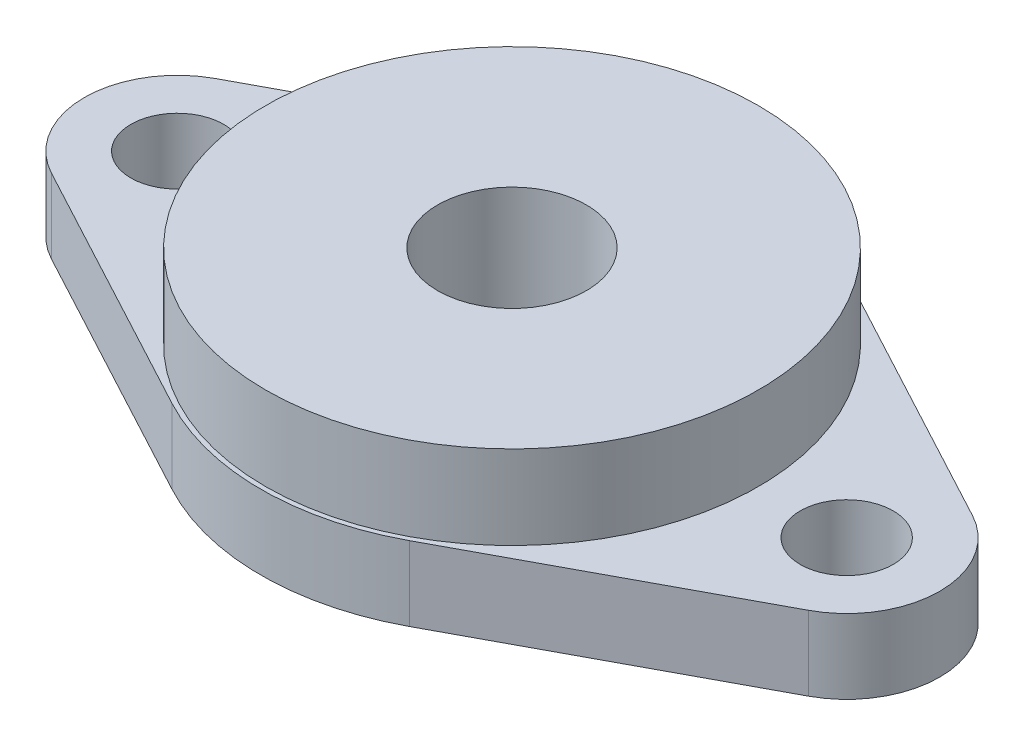
ISO-10303-21;
HEADER;
FILE_DESCRIPTION(('STEP AP214'),'2;1');
FILE_NAME('part.step','',(''),(''),'','','');
FILE_SCHEMA(('AUTOMOTIVE_DESIGN { 1 0 10303 214 1 1 1 1 }'));
ENDSEC;
DATA;
#1=APPLICATION_CONTEXT('core data for automotive mechanical design processes');
#2=APPLICATION_PROTOCOL_DEFINITION('international standard','automotive_design',2000,#1);
#3=PRODUCT_CONTEXT('',#1,'mechanical');
#4=PRODUCT('Part','Part','',(#3));
#5=PRODUCT_RELATED_PRODUCT_CATEGORY('part','',(#4));
#6=PRODUCT_DEFINITION_FORMATION('','',#4);
#7=PRODUCT_DEFINITION_CONTEXT('part definition',#1,'design');
#8=PRODUCT_DEFINITION('design','',#6,#7);
#9=PRODUCT_DEFINITION_SHAPE('','',#8);
#10=(LENGTH_UNIT() NAMED_UNIT(*) SI_UNIT(.MILLI.,.METRE.));
#11=(NAMED_UNIT(*) PLANE_ANGLE_UNIT() SI_UNIT($,.RADIAN.));
#12=(NAMED_UNIT(*) SI_UNIT($,.STERADIAN.) SOLID_ANGLE_UNIT());
#13=UNCERTAINTY_MEASURE_WITH_UNIT(LENGTH_MEASURE(1.E-05),#10,'distance_accuracy_value','');
#14=(GEOMETRIC_REPRESENTATION_CONTEXT(3) GLOBAL_UNCERTAINTY_ASSIGNED_CONTEXT((#13)) GLOBAL_UNIT_ASSIGNED_CONTEXT((#10,
#11,#12)) REPRESENTATION_CONTEXT('',''));
#15=CARTESIAN_POINT('',(0.,0.,0.));
#16=DIRECTION('',(0.,0.,1.));
#17=DIRECTION('',(1.,0.,0.));
#18=AXIS2_PLACEMENT_3D('',#15,#16,#17);
#19=CARTESIAN_POINT('',(0.,4.,0.));
#20=DIRECTION('',(0.,1.,0.));
#21=DIRECTION('',(0.,0.,1.));
#22=AXIS2_PLACEMENT_3D('',#19,#20,#21);
#23=PLANE('',#22);
#24=CARTESIAN_POINT('',(-18.,4.,0.));
#25=DIRECTION('',(0.,1.,0.));
#26=DIRECTION('',(0.,0.,1.));
#27=AXIS2_PLACEMENT_3D('',#24,#25,#26);
#28=CIRCLE('',#27,2.5);
#29=CARTESIAN_POINT('',(-18.,4.,2.5));
#30=VERTEX_POINT('',#29);
#31=EDGE_CURVE('E137',#30,#30,#28,.F.);
#32=ORIENTED_EDGE('',*,*,#31,.T.);
#33=EDGE_LOOP('',(#32));
#34=FACE_BOUND('',#33,.T.);
#35=CARTESIAN_POINT('',(18.,4.,0.));
#36=DIRECTION('',(0.,1.,0.));
#37=DIRECTION('',(0.,0.,1.));
#38=AXIS2_PLACEMENT_3D('',#35,#36,#37);
#39=CIRCLE('',#38,2.5);
#40=CARTESIAN_POINT('',(18.,4.,2.5));
#41=VERTEX_POINT('',#40);
#42=EDGE_CURVE('E131',#41,#41,#39,.T.);
#43=ORIENTED_EDGE('',*,*,#42,.F.);
#44=EDGE_LOOP('',(#43));
#45=FACE_BOUND('',#44,.T.);
#46=CARTESIAN_POINT('',(-18.,4.,0.));
#47=DIRECTION('',(0.,1.,0.));
#48=DIRECTION('',(0.,0.,1.));
#49=AXIS2_PLACEMENT_3D('',#46,#47,#48);
#50=CIRCLE('',#49,4.99999999999999);
#51=CARTESIAN_POINT('',(-20.3611111111111,4.,4.407397681284));
#52=VERTEX_POINT('',#51);
#53=CARTESIAN_POINT('',(-20.3611111111111,4.,-4.407397681284));
#54=VERTEX_POINT('',#53);
#55=EDGE_CURVE('E169',#52,#54,#50,.F.);
#56=ORIENTED_EDGE('',*,*,#55,.F.);
#57=DIRECTION('',(0.881479536256802,0.,0.472222222222222));
#58=VECTOR('',#57,1.);
#59=CARTESIAN_POINT('',(-6.37499999999999,4.,11.8999737394668));
#60=LINE('',#59,#58);
#61=CARTESIAN_POINT('',(-6.37499999999999,4.,11.8999737394668));
#62=VERTEX_POINT('',#61);
#63=EDGE_CURVE('E195',#52,#62,#60,.T.);
#64=ORIENTED_EDGE('',*,*,#63,.T.);
#65=CARTESIAN_POINT('',(0.,4.,0.));
#66=DIRECTION('',(0.,1.,0.));
#67=DIRECTION('',(0.,0.,1.));
#68=AXIS2_PLACEMENT_3D('',#65,#66,#67);
#69=CIRCLE('',#68,13.5);
#70=CARTESIAN_POINT('',(6.37499999999999,4.,11.8999737394668));
#71=VERTEX_POINT('',#70);
#72=EDGE_CURVE('E182',#71,#62,#69,.F.);
#73=ORIENTED_EDGE('',*,*,#72,.F.);
#74=DIRECTION('',(-0.881479536256802,0.,0.472222222222222));
#75=VECTOR('',#74,1.);
#76=CARTESIAN_POINT('',(6.37499999999999,4.,11.8999737394668));
#77=LINE('',#76,#75);
#78=CARTESIAN_POINT('',(20.3611111111111,4.,4.40739768128401));
#79=VERTEX_POINT('',#78);
#80=EDGE_CURVE('E194',#79,#71,#77,.T.);
#81=ORIENTED_EDGE('',*,*,#80,.F.);
#82=CARTESIAN_POINT('',(18.,4.,0.));
#83=DIRECTION('',(0.,1.,0.));
#84=DIRECTION('',(0.,0.,1.));
#85=AXIS2_PLACEMENT_3D('',#82,#83,#84);
#86=CIRCLE('',#85,5.);
#87=CARTESIAN_POINT('',(20.3611111111111,4.,-4.40739768128401));
#88=VERTEX_POINT('',#87);
#89=EDGE_CURVE('E114',#79,#88,#86,.T.);
#90=ORIENTED_EDGE('',*,*,#89,.T.);
#91=DIRECTION('',(-0.881479536256802,0.,-0.472222222222222));
#92=VECTOR('',#91,1.);
#93=CARTESIAN_POINT('',(6.37499999999999,4.,-11.8999737394668));
#94=LINE('',#93,#92);
#95=CARTESIAN_POINT('',(6.37499999999999,4.,-11.8999737394668));
#96=VERTEX_POINT('',#95);
#97=EDGE_CURVE('E105',#88,#96,#94,.T.);
#98=ORIENTED_EDGE('',*,*,#97,.T.);
#99=CARTESIAN_POINT('',(0.,4.,0.));
#100=DIRECTION('',(0.,1.,0.));
#101=DIRECTION('',(0.,0.,1.));
#102=AXIS2_PLACEMENT_3D('',#99,#100,#101);
#103=CIRCLE('',#102,13.5);
#104=CARTESIAN_POINT('',(-6.37499999999999,4.,-11.8999737394668));
#105=VERTEX_POINT('',#104);
#106=EDGE_CURVE('E111',#96,#105,#103,.T.);
#107=ORIENTED_EDGE('',*,*,#106,.T.);
#108=DIRECTION('',(0.881479536256802,0.,-0.472222222222222));
#109=VECTOR('',#108,1.);
#110=CARTESIAN_POINT('',(-6.37499999999999,4.,-11.8999737394668));
#111=LINE('',#110,#109);
#112=EDGE_CURVE('E129',#54,#105,#111,.T.);
#113=ORIENTED_EDGE('',*,*,#112,.F.);
#114=EDGE_LOOP('',(#56,#64,#73,#81,#90,#98,#107,#113));
#115=FACE_BOUND('',#114,.T.);
#116=CARTESIAN_POINT('',(0.,4.,0.));
#117=DIRECTION('',(0.,1.,0.));
#118=DIRECTION('',(0.,0.,1.));
#119=AXIS2_PLACEMENT_3D('',#116,#117,#118);
#120=CIRCLE('',#119,13.25);
#121=CARTESIAN_POINT('',(0.,4.,13.25));
#122=VERTEX_POINT('',#121);
#123=EDGE_CURVE('E201',#122,#122,#120,.T.);
#124=ORIENTED_EDGE('',*,*,#123,.F.);
#125=EDGE_LOOP('',(#124));
#126=FACE_BOUND('',#125,.T.);
#127=ADVANCED_FACE('F38',(#34,#45,#115,#126),#23,.T.);
#128=CARTESIAN_POINT('',(-18.,4.,0.));
#129=DIRECTION('',(0.,-1.,0.));
#130=DIRECTION('',(0.,0.,-1.));
#131=AXIS2_PLACEMENT_3D('',#128,#129,#130);
#132=CYLINDRICAL_SURFACE('',#131,4.99999999999999);
#133=CARTESIAN_POINT('',(-18.,0.,0.));
#134=DIRECTION('',(0.,1.,0.));
#135=DIRECTION('',(0.,0.,1.));
#136=AXIS2_PLACEMENT_3D('',#133,#134,#135);
#137=CIRCLE('',#136,4.99999999999999);
#138=CARTESIAN_POINT('',(-20.3611111111111,0.,4.407397681284));
#139=VERTEX_POINT('',#138);
#140=CARTESIAN_POINT('',(-20.3611111111111,0.,-4.407397681284));
#141=VERTEX_POINT('',#140);
#142=EDGE_CURVE('E140',#139,#141,#137,.F.);
#143=ORIENTED_EDGE('',*,*,#142,.F.);
#144=DIRECTION('',(0.,-1.,0.));
#145=VECTOR('',#144,1.);
#146=CARTESIAN_POINT('',(-20.3611111111111,4.,4.407397681284));
#147=LINE('',#146,#145);
#148=EDGE_CURVE('E11',#52,#139,#147,.T.);
#149=ORIENTED_EDGE('',*,*,#148,.F.);
#150=ORIENTED_EDGE('',*,*,#55,.T.);
#151=DIRECTION('',(0.,-1.,0.));
#152=VECTOR('',#151,1.);
#153=CARTESIAN_POINT('',(-20.3611111111111,4.,-4.407397681284));
#154=LINE('',#153,#152);
#155=EDGE_CURVE('E55',#54,#141,#154,.T.);
#156=ORIENTED_EDGE('',*,*,#155,.T.);
#157=EDGE_LOOP('',(#143,#149,#150,#156));
#158=FACE_BOUND('',#157,.T.);
#159=ADVANCED_FACE('F40',(#158),#132,.T.);
#160=CARTESIAN_POINT('',(-6.37499999999999,4.,11.8999737394668));
#161=DIRECTION('',(0.472222222222222,0.,-0.881479536256802));
#162=DIRECTION('',(-0.881479536256802,0.,-0.472222222222222));
#163=AXIS2_PLACEMENT_3D('',#160,#161,#162);
#164=PLANE('',#163);
#165=DIRECTION('',(0.881479536256802,0.,0.472222222222222));
#166=VECTOR('',#165,1.);
#167=CARTESIAN_POINT('',(-6.37499999999999,0.,11.8999737394668));
#168=LINE('',#167,#166);
#169=CARTESIAN_POINT('',(-6.37499999999999,0.,11.8999737394668));
#170=VERTEX_POINT('',#169);
#171=EDGE_CURVE('E142',#139,#170,#168,.T.);
#172=ORIENTED_EDGE('',*,*,#171,.T.);
#173=DIRECTION('',(0.,-1.,0.));
#174=VECTOR('',#173,1.);
#175=CARTESIAN_POINT('',(-6.37499999999999,4.,11.8999737394668));
#176=LINE('',#175,#174);
#177=EDGE_CURVE('E47',#62,#170,#176,.T.);
#178=ORIENTED_EDGE('',*,*,#177,.F.);
#179=ORIENTED_EDGE('',*,*,#63,.F.);
#180=ORIENTED_EDGE('',*,*,#148,.T.);
#181=EDGE_LOOP('',(#172,#178,#179,#180));
#182=FACE_BOUND('',#181,.T.);
#183=ADVANCED_FACE('F185',(#182),#164,.F.);
#184=CARTESIAN_POINT('',(0.,4.,0.));
#185=DIRECTION('',(0.,-1.,0.));
#186=DIRECTION('',(0.,0.,-1.));
#187=AXIS2_PLACEMENT_3D('',#184,#185,#186);
#188=CYLINDRICAL_SURFACE('',#187,13.5);
#189=CARTESIAN_POINT('',(0.,0.,0.));
#190=DIRECTION('',(0.,1.,0.));
#191=DIRECTION('',(0.,0.,1.));
#192=AXIS2_PLACEMENT_3D('',#189,#190,#191);
#193=CIRCLE('',#192,13.5);
#194=CARTESIAN_POINT('',(6.37499999999999,0.,11.8999737394668));
#195=VERTEX_POINT('',#194);
#196=EDGE_CURVE('E146',#195,#170,#193,.F.);
#197=ORIENTED_EDGE('',*,*,#196,.F.);
#198=DIRECTION('',(0.,-1.,0.));
#199=VECTOR('',#198,1.);
#200=CARTESIAN_POINT('',(6.37499999999999,4.,11.8999737394668));
#201=LINE('',#200,#199);
#202=EDGE_CURVE('E175',#71,#195,#201,.T.);
#203=ORIENTED_EDGE('',*,*,#202,.F.);
#204=ORIENTED_EDGE('',*,*,#72,.T.);
#205=ORIENTED_EDGE('',*,*,#177,.T.);
#206=EDGE_LOOP('',(#197,#203,#204,#205));
#207=FACE_BOUND('',#206,.T.);
#208=ADVANCED_FACE('F180',(#207),#188,.T.);
#209=CARTESIAN_POINT('',(6.37499999999999,4.,11.8999737394668));
#210=DIRECTION('',(0.472222222222222,0.,0.881479536256802));
#211=DIRECTION('',(0.881479536256802,0.,-0.472222222222222));
#212=AXIS2_PLACEMENT_3D('',#209,#210,#211);
#213=PLANE('',#212);
#214=DIRECTION('',(-0.881479536256802,0.,0.472222222222222));
#215=VECTOR('',#214,1.);
#216=CARTESIAN_POINT('',(6.37499999999999,0.,11.8999737394668));
#217=LINE('',#216,#215);
#218=CARTESIAN_POINT('',(20.3611111111111,0.,4.40739768128401));
#219=VERTEX_POINT('',#218);
#220=EDGE_CURVE('E149',#219,#195,#217,.T.);
#221=ORIENTED_EDGE('',*,*,#220,.F.);
#222=DIRECTION('',(0.,-1.,0.));
#223=VECTOR('',#222,1.);
#224=CARTESIAN_POINT('',(20.3611111111111,4.,4.40739768128401));
#225=LINE('',#224,#223);
#226=EDGE_CURVE('E173',#79,#219,#225,.T.);
#227=ORIENTED_EDGE('',*,*,#226,.F.);
#228=ORIENTED_EDGE('',*,*,#80,.T.);
#229=ORIENTED_EDGE('',*,*,#202,.T.);
#230=EDGE_LOOP('',(#221,#227,#228,#229));
#231=FACE_BOUND('',#230,.T.);
#232=ADVANCED_FACE('F192',(#231),#213,.T.);
#233=CARTESIAN_POINT('',(18.,4.,0.));
#234=DIRECTION('',(0.,-1.,0.));
#235=DIRECTION('',(0.,0.,-1.));
#236=AXIS2_PLACEMENT_3D('',#233,#234,#235);
#237=CYLINDRICAL_SURFACE('',#236,5.);
#238=CARTESIAN_POINT('',(18.,0.,0.));
#239=DIRECTION('',(0.,1.,0.));
#240=DIRECTION('',(0.,0.,1.));
#241=AXIS2_PLACEMENT_3D('',#238,#239,#240);
#242=CIRCLE('',#241,5.);
#243=CARTESIAN_POINT('',(20.3611111111111,0.,-4.40739768128401));
#244=VERTEX_POINT('',#243);
#245=EDGE_CURVE('E152',#219,#244,#242,.T.);
#246=ORIENTED_EDGE('',*,*,#245,.T.);
#247=DIRECTION('',(0.,-1.,0.));
#248=VECTOR('',#247,1.);
#249=CARTESIAN_POINT('',(20.3611111111111,4.,-4.40739768128401));
#250=LINE('',#249,#248);
#251=EDGE_CURVE('E126',#88,#244,#250,.T.);
#252=ORIENTED_EDGE('',*,*,#251,.F.);
#253=ORIENTED_EDGE('',*,*,#89,.F.);
#254=ORIENTED_EDGE('',*,*,#226,.T.);
#255=EDGE_LOOP('',(#246,#252,#253,#254));
#256=FACE_BOUND('',#255,.T.);
#257=ADVANCED_FACE('F250',(#256),#237,.T.);
#258=CARTESIAN_POINT('',(6.37499999999999,4.,-11.8999737394668));
#259=DIRECTION('',(-0.472222222222222,0.,0.881479536256802));
#260=DIRECTION('',(0.881479536256802,0.,0.472222222222222));
#261=AXIS2_PLACEMENT_3D('',#258,#259,#260);
#262=PLANE('',#261);
#263=DIRECTION('',(-0.881479536256802,0.,-0.472222222222222));
#264=VECTOR('',#263,1.);
#265=CARTESIAN_POINT('',(6.37499999999999,0.,-11.8999737394668));
#266=LINE('',#265,#264);
#267=CARTESIAN_POINT('',(6.37499999999999,0.,-11.8999737394668));
#268=VERTEX_POINT('',#267);
#269=EDGE_CURVE('E123',#244,#268,#266,.T.);
#270=ORIENTED_EDGE('',*,*,#269,.T.);
#271=DIRECTION('',(0.,-1.,0.));
#272=VECTOR('',#271,1.);
#273=CARTESIAN_POINT('',(6.37499999999999,4.,-11.8999737394668));
#274=LINE('',#273,#272);
#275=EDGE_CURVE('E120',#96,#268,#274,.T.);
#276=ORIENTED_EDGE('',*,*,#275,.F.);
#277=ORIENTED_EDGE('',*,*,#97,.F.);
#278=ORIENTED_EDGE('',*,*,#251,.T.);
#279=EDGE_LOOP('',(#270,#276,#277,#278));
#280=FACE_BOUND('',#279,.T.);
#281=ADVANCED_FACE('F121',(#280),#262,.F.);
#282=CARTESIAN_POINT('',(0.,4.,0.));
#283=DIRECTION('',(0.,-1.,0.));
#284=DIRECTION('',(0.,0.,-1.));
#285=AXIS2_PLACEMENT_3D('',#282,#283,#284);
#286=CYLINDRICAL_SURFACE('',#285,13.5);
#287=CARTESIAN_POINT('',(0.,0.,0.));
#288=DIRECTION('',(0.,1.,0.));
#289=DIRECTION('',(0.,0.,1.));
#290=AXIS2_PLACEMENT_3D('',#287,#288,#289);
#291=CIRCLE('',#290,13.5);
#292=CARTESIAN_POINT('',(-6.37499999999999,0.,-11.8999737394668));
#293=VERTEX_POINT('',#292);
#294=EDGE_CURVE('E155',#268,#293,#291,.T.);
#295=ORIENTED_EDGE('',*,*,#294,.T.);
#296=DIRECTION('',(0.,-1.,0.));
#297=VECTOR('',#296,1.);
#298=CARTESIAN_POINT('',(-6.37499999999999,4.,-11.8999737394668));
#299=LINE('',#298,#297);
#300=EDGE_CURVE('E81',#105,#293,#299,.T.);
#301=ORIENTED_EDGE('',*,*,#300,.F.);
#302=ORIENTED_EDGE('',*,*,#106,.F.);
#303=ORIENTED_EDGE('',*,*,#275,.T.);
#304=EDGE_LOOP('',(#295,#301,#302,#303));
#305=FACE_BOUND('',#304,.T.);
#306=ADVANCED_FACE('F128',(#305),#286,.T.);
#307=CARTESIAN_POINT('',(18.,4.,0.));
#308=DIRECTION('',(0.,-1.,0.));
#309=DIRECTION('',(0.,0.,-1.));
#310=AXIS2_PLACEMENT_3D('',#307,#308,#309);
#311=CYLINDRICAL_SURFACE('',#310,2.5);
#312=ORIENTED_EDGE('',*,*,#42,.T.);
#313=EDGE_LOOP('',(#312));
#314=FACE_BOUND('',#313,.T.);
#315=CARTESIAN_POINT('',(18.,0.,0.));
#316=DIRECTION('',(0.,1.,0.));
#317=DIRECTION('',(0.,0.,1.));
#318=AXIS2_PLACEMENT_3D('',#315,#316,#317);
#319=CIRCLE('',#318,2.5);
#320=CARTESIAN_POINT('',(18.,0.,2.5));
#321=VERTEX_POINT('',#320);
#322=EDGE_CURVE('E163',#321,#321,#319,.T.);
#323=ORIENTED_EDGE('',*,*,#322,.F.);
#324=EDGE_LOOP('',(#323));
#325=FACE_BOUND('',#324,.T.);
#326=ADVANCED_FACE('F237',(#314,#325),#311,.F.);
#327=CARTESIAN_POINT('',(0.,4.,0.));
#328=DIRECTION('',(0.,-1.,0.));
#329=DIRECTION('',(0.,0.,-1.));
#330=AXIS2_PLACEMENT_3D('',#327,#328,#329);
#331=CYLINDRICAL_SURFACE('',#330,4.);
#332=CARTESIAN_POINT('',(0.,0.,0.));
#333=DIRECTION('',(0.,1.,0.));
#334=DIRECTION('',(0.,0.,1.));
#335=AXIS2_PLACEMENT_3D('',#332,#333,#334);
#336=CIRCLE('',#335,4.);
#337=CARTESIAN_POINT('',(0.,0.,4.));
#338=VERTEX_POINT('',#337);
#339=EDGE_CURVE('E160',#338,#338,#336,.T.);
#340=ORIENTED_EDGE('',*,*,#339,.F.);
#341=EDGE_LOOP('',(#340));
#342=FACE_BOUND('',#341,.T.);
#343=CARTESIAN_POINT('',(0.,8.5,0.));
#344=DIRECTION('',(0.,1.,0.));
#345=DIRECTION('',(0.,0.,1.));
#346=AXIS2_PLACEMENT_3D('',#343,#344,#345);
#347=CIRCLE('',#346,4.);
#348=CARTESIAN_POINT('',(0.,8.5,4.));
#349=VERTEX_POINT('',#348);
#350=EDGE_CURVE('E204',#349,#349,#347,.T.);
#351=ORIENTED_EDGE('',*,*,#350,.T.);
#352=EDGE_LOOP('',(#351));
#353=FACE_BOUND('',#352,.T.);
#354=ADVANCED_FACE('F210',(#342,#353),#331,.F.);
#355=CARTESIAN_POINT('',(-6.37499999999999,4.,-11.8999737394668));
#356=DIRECTION('',(-0.472222222222222,0.,-0.881479536256802));
#357=DIRECTION('',(-0.881479536256802,0.,0.472222222222222));
#358=AXIS2_PLACEMENT_3D('',#355,#356,#357);
#359=PLANE('',#358);
#360=DIRECTION('',(0.881479536256802,0.,-0.472222222222222));
#361=VECTOR('',#360,1.);
#362=CARTESIAN_POINT('',(-6.37499999999999,0.,-11.8999737394668));
#363=LINE('',#362,#361);
#364=EDGE_CURVE('E157',#141,#293,#363,.T.);
#365=ORIENTED_EDGE('',*,*,#364,.F.);
#366=ORIENTED_EDGE('',*,*,#155,.F.);
#367=ORIENTED_EDGE('',*,*,#112,.T.);
#368=ORIENTED_EDGE('',*,*,#300,.T.);
#369=EDGE_LOOP('',(#365,#366,#367,#368));
#370=FACE_BOUND('',#369,.T.);
#371=ADVANCED_FACE('F235',(#370),#359,.T.);
#372=CARTESIAN_POINT('',(-18.,4.,0.));
#373=DIRECTION('',(0.,-1.,0.));
#374=DIRECTION('',(0.,0.,-1.));
#375=AXIS2_PLACEMENT_3D('',#372,#373,#374);
#376=CYLINDRICAL_SURFACE('',#375,2.5);
#377=ORIENTED_EDGE('',*,*,#31,.F.);
#378=EDGE_LOOP('',(#377));
#379=FACE_BOUND('',#378,.T.);
#380=CARTESIAN_POINT('',(-18.,0.,0.));
#381=DIRECTION('',(0.,1.,0.));
#382=DIRECTION('',(0.,0.,1.));
#383=AXIS2_PLACEMENT_3D('',#380,#381,#382);
#384=CIRCLE('',#383,2.5);
#385=CARTESIAN_POINT('',(-18.,0.,2.5));
#386=VERTEX_POINT('',#385);
#387=EDGE_CURVE('E166',#386,#386,#384,.F.);
#388=ORIENTED_EDGE('',*,*,#387,.T.);
#389=EDGE_LOOP('',(#388));
#390=FACE_BOUND('',#389,.T.);
#391=ADVANCED_FACE('F223',(#379,#390),#376,.F.);
#392=CARTESIAN_POINT('',(0.,0.,0.));
#393=DIRECTION('',(0.,1.,0.));
#394=DIRECTION('',(0.,0.,1.));
#395=AXIS2_PLACEMENT_3D('',#392,#393,#394);
#396=PLANE('',#395);
#397=ORIENTED_EDGE('',*,*,#142,.T.);
#398=ORIENTED_EDGE('',*,*,#364,.T.);
#399=ORIENTED_EDGE('',*,*,#294,.F.);
#400=ORIENTED_EDGE('',*,*,#269,.F.);
#401=ORIENTED_EDGE('',*,*,#245,.F.);
#402=ORIENTED_EDGE('',*,*,#220,.T.);
#403=ORIENTED_EDGE('',*,*,#196,.T.);
#404=ORIENTED_EDGE('',*,*,#171,.F.);
#405=EDGE_LOOP('',(#397,#398,#399,#400,#401,#402,#403,#404));
#406=FACE_BOUND('',#405,.T.);
#407=ORIENTED_EDGE('',*,*,#339,.T.);
#408=EDGE_LOOP('',(#407));
#409=FACE_BOUND('',#408,.T.);
#410=ORIENTED_EDGE('',*,*,#322,.T.);
#411=EDGE_LOOP('',(#410));
#412=FACE_BOUND('',#411,.T.);
#413=ORIENTED_EDGE('',*,*,#387,.F.);
#414=EDGE_LOOP('',(#413));
#415=FACE_BOUND('',#414,.T.);
#416=ADVANCED_FACE('F187',(#406,#409,#412,#415),#396,.F.);
#417=CARTESIAN_POINT('',(0.,8.5,0.));
#418=DIRECTION('',(0.,1.,0.));
#419=DIRECTION('',(0.,0.,1.));
#420=AXIS2_PLACEMENT_3D('',#417,#418,#419);
#421=PLANE('',#420);
#422=CARTESIAN_POINT('',(0.,8.5,0.));
#423=DIRECTION('',(0.,1.,0.));
#424=DIRECTION('',(0.,0.,1.));
#425=AXIS2_PLACEMENT_3D('',#422,#423,#424);
#426=CIRCLE('',#425,13.25);
#427=CARTESIAN_POINT('',(0.,8.5,13.25));
#428=VERTEX_POINT('',#427);
#429=EDGE_CURVE('E143',#428,#428,#426,.T.);
#430=ORIENTED_EDGE('',*,*,#429,.T.);
#431=EDGE_LOOP('',(#430));
#432=FACE_BOUND('',#431,.T.);
#433=ORIENTED_EDGE('',*,*,#350,.F.);
#434=EDGE_LOOP('',(#433));
#435=FACE_BOUND('',#434,.T.);
#436=ADVANCED_FACE('F212',(#432,#435),#421,.T.);
#437=CARTESIAN_POINT('',(0.,8.5,0.));
#438=DIRECTION('',(0.,-1.,0.));
#439=DIRECTION('',(0.,0.,-1.));
#440=AXIS2_PLACEMENT_3D('',#437,#438,#439);
#441=CYLINDRICAL_SURFACE('',#440,13.25);
#442=ORIENTED_EDGE('',*,*,#429,.F.);
#443=EDGE_LOOP('',(#442));
#444=FACE_BOUND('',#443,.T.);
#445=ORIENTED_EDGE('',*,*,#123,.T.);
#446=EDGE_LOOP('',(#445));
#447=FACE_BOUND('',#446,.T.);
#448=ADVANCED_FACE('F214',(#444,#447),#441,.T.);
#449=CLOSED_SHELL('',(#127,#159,#183,#208,#232,#257,#281,#306,#326,#354,#371,#391,#416,#436,#448));
#450=MANIFOLD_SOLID_BREP('B2',#449);
#451=ADVANCED_BREP_SHAPE_REPRESENTATION('',(#18,#450),#14);
#452=SHAPE_DEFINITION_REPRESENTATION(#9,#451);
ENDSEC;
END-ISO-10303-21;
